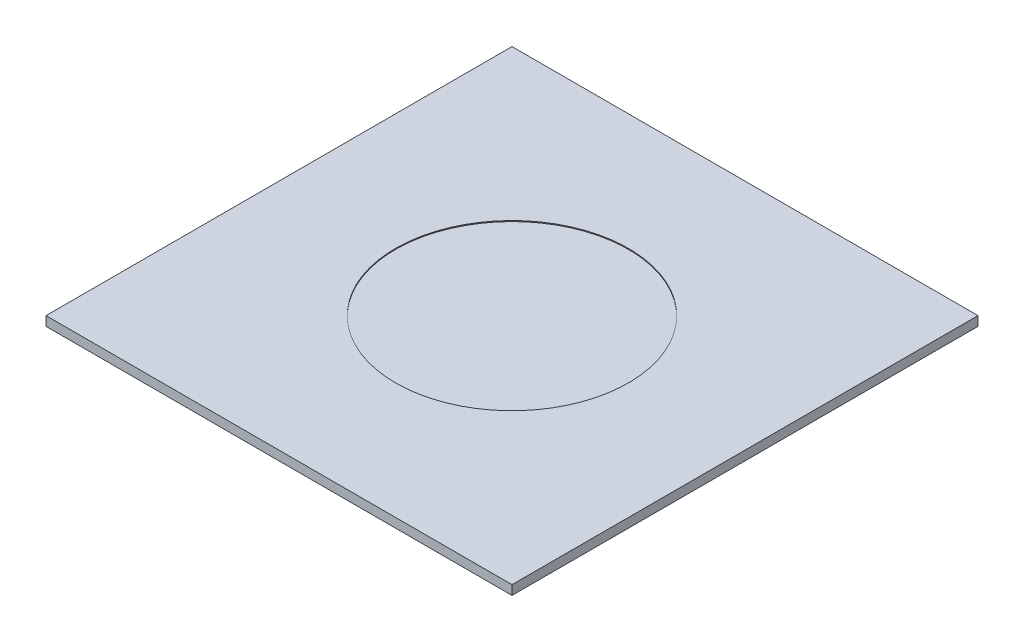
ISO-10303-21;
HEADER;
FILE_DESCRIPTION(('STEP AP214'),'2;1');
FILE_NAME('part.step','',(''),(''),'','','');
FILE_SCHEMA(('AUTOMOTIVE_DESIGN { 1 0 10303 214 1 1 1 1 }'));
ENDSEC;
DATA;
#1=APPLICATION_CONTEXT('core data for automotive mechanical design processes');
#2=APPLICATION_PROTOCOL_DEFINITION('international standard','automotive_design',2000,#1);
#3=PRODUCT_CONTEXT('',#1,'mechanical');
#4=PRODUCT('Part','Part','',(#3));
#5=PRODUCT_RELATED_PRODUCT_CATEGORY('part','',(#4));
#6=PRODUCT_DEFINITION_FORMATION('','',#4);
#7=PRODUCT_DEFINITION_CONTEXT('part definition',#1,'design');
#8=PRODUCT_DEFINITION('design','',#6,#7);
#9=PRODUCT_DEFINITION_SHAPE('','',#8);
#10=(LENGTH_UNIT() NAMED_UNIT(*) SI_UNIT(.MILLI.,.METRE.));
#11=(NAMED_UNIT(*) PLANE_ANGLE_UNIT() SI_UNIT($,.RADIAN.));
#12=(NAMED_UNIT(*) SI_UNIT($,.STERADIAN.) SOLID_ANGLE_UNIT());
#13=UNCERTAINTY_MEASURE_WITH_UNIT(LENGTH_MEASURE(1.E-05),#10,'distance_accuracy_value','');
#14=(GEOMETRIC_REPRESENTATION_CONTEXT(3) GLOBAL_UNCERTAINTY_ASSIGNED_CONTEXT((#13)) GLOBAL_UNIT_ASSIGNED_CONTEXT((#10,
#11,#12)) REPRESENTATION_CONTEXT('',''));
#15=CARTESIAN_POINT('',(0.,0.,0.));
#16=DIRECTION('',(0.,0.,1.));
#17=DIRECTION('',(1.,0.,0.));
#18=AXIS2_PLACEMENT_3D('',#15,#16,#17);
#19=CARTESIAN_POINT('',(250.,5.,-250.));
#20=DIRECTION('',(-1.,0.,0.));
#21=DIRECTION('',(0.,0.,1.));
#22=AXIS2_PLACEMENT_3D('',#19,#20,#21);
#23=PLANE('',#22);
#24=DIRECTION('',(0.,0.,-1.));
#25=VECTOR('',#24,1.);
#26=CARTESIAN_POINT('',(250.,-5.,-250.));
#27=LINE('',#26,#25);
#28=CARTESIAN_POINT('',(250.,-5.,250.));
#29=VERTEX_POINT('',#28);
#30=CARTESIAN_POINT('',(250.,-5.,-250.));
#31=VERTEX_POINT('',#30);
#32=EDGE_CURVE('E96',#29,#31,#27,.T.);
#33=ORIENTED_EDGE('',*,*,#32,.T.);
#34=DIRECTION('',(0.,-1.,0.));
#35=VECTOR('',#34,1.);
#36=CARTESIAN_POINT('',(250.,5.,-250.));
#37=LINE('',#36,#35);
#38=CARTESIAN_POINT('',(250.,5.,-250.));
#39=VERTEX_POINT('',#38);
#40=EDGE_CURVE('E11',#39,#31,#37,.T.);
#41=ORIENTED_EDGE('',*,*,#40,.F.);
#42=DIRECTION('',(0.,0.,-1.));
#43=VECTOR('',#42,1.);
#44=CARTESIAN_POINT('',(250.,5.,-250.));
#45=LINE('',#44,#43);
#46=CARTESIAN_POINT('',(250.,5.,250.));
#47=VERTEX_POINT('',#46);
#48=EDGE_CURVE('E84',#47,#39,#45,.T.);
#49=ORIENTED_EDGE('',*,*,#48,.F.);
#50=DIRECTION('',(0.,-1.,0.));
#51=VECTOR('',#50,1.);
#52=CARTESIAN_POINT('',(250.,5.,250.));
#53=LINE('',#52,#51);
#54=EDGE_CURVE('E92',#47,#29,#53,.T.);
#55=ORIENTED_EDGE('',*,*,#54,.T.);
#56=EDGE_LOOP('',(#33,#41,#49,#55));
#57=FACE_BOUND('',#56,.T.);
#58=ADVANCED_FACE('F33',(#57),#23,.F.);
#59=CARTESIAN_POINT('',(-250.,5.,-250.));
#60=DIRECTION('',(0.,0.,1.));
#61=DIRECTION('',(1.,0.,0.));
#62=AXIS2_PLACEMENT_3D('',#59,#60,#61);
#63=PLANE('',#62);
#64=DIRECTION('',(-1.,0.,0.));
#65=VECTOR('',#64,1.);
#66=CARTESIAN_POINT('',(-250.,-5.,-250.));
#67=LINE('',#66,#65);
#68=CARTESIAN_POINT('',(-250.,-5.,-250.));
#69=VERTEX_POINT('',#68);
#70=EDGE_CURVE('E88',#31,#69,#67,.T.);
#71=ORIENTED_EDGE('',*,*,#70,.T.);
#72=DIRECTION('',(0.,-1.,0.));
#73=VECTOR('',#72,1.);
#74=CARTESIAN_POINT('',(-250.,5.,-250.));
#75=LINE('',#74,#73);
#76=CARTESIAN_POINT('',(-250.,5.,-250.));
#77=VERTEX_POINT('',#76);
#78=EDGE_CURVE('E41',#77,#69,#75,.T.);
#79=ORIENTED_EDGE('',*,*,#78,.F.);
#80=DIRECTION('',(-1.,0.,0.));
#81=VECTOR('',#80,1.);
#82=CARTESIAN_POINT('',(-250.,5.,-250.));
#83=LINE('',#82,#81);
#84=EDGE_CURVE('E79',#39,#77,#83,.T.);
#85=ORIENTED_EDGE('',*,*,#84,.F.);
#86=ORIENTED_EDGE('',*,*,#40,.T.);
#87=EDGE_LOOP('',(#71,#79,#85,#86));
#88=FACE_BOUND('',#87,.T.);
#89=ADVANCED_FACE('F87',(#88),#63,.F.);
#90=CARTESIAN_POINT('',(-250.,5.,-250.));
#91=DIRECTION('',(1.,0.,0.));
#92=DIRECTION('',(0.,0.,-1.));
#93=AXIS2_PLACEMENT_3D('',#90,#91,#92);
#94=PLANE('',#93);
#95=DIRECTION('',(0.,0.,1.));
#96=VECTOR('',#95,1.);
#97=CARTESIAN_POINT('',(-250.,-5.,-250.));
#98=LINE('',#97,#96);
#99=CARTESIAN_POINT('',(-250.,-5.,250.));
#100=VERTEX_POINT('',#99);
#101=EDGE_CURVE('E66',#69,#100,#98,.T.);
#102=ORIENTED_EDGE('',*,*,#101,.T.);
#103=DIRECTION('',(0.,-1.,0.));
#104=VECTOR('',#103,1.);
#105=CARTESIAN_POINT('',(-250.,5.,250.));
#106=LINE('',#105,#104);
#107=CARTESIAN_POINT('',(-250.,5.,250.));
#108=VERTEX_POINT('',#107);
#109=EDGE_CURVE('E89',#108,#100,#106,.T.);
#110=ORIENTED_EDGE('',*,*,#109,.F.);
#111=DIRECTION('',(0.,0.,1.));
#112=VECTOR('',#111,1.);
#113=CARTESIAN_POINT('',(-250.,5.,-250.));
#114=LINE('',#113,#112);
#115=EDGE_CURVE('E82',#77,#108,#114,.T.);
#116=ORIENTED_EDGE('',*,*,#115,.F.);
#117=ORIENTED_EDGE('',*,*,#78,.T.);
#118=EDGE_LOOP('',(#102,#110,#116,#117));
#119=FACE_BOUND('',#118,.T.);
#120=ADVANCED_FACE('F90',(#119),#94,.F.);
#121=CARTESIAN_POINT('',(-250.,5.,250.));
#122=DIRECTION('',(0.,0.,-1.));
#123=DIRECTION('',(-1.,0.,0.));
#124=AXIS2_PLACEMENT_3D('',#121,#122,#123);
#125=PLANE('',#124);
#126=DIRECTION('',(1.,0.,0.));
#127=VECTOR('',#126,1.);
#128=CARTESIAN_POINT('',(-250.,-5.,250.));
#129=LINE('',#128,#127);
#130=EDGE_CURVE('E72',#100,#29,#129,.T.);
#131=ORIENTED_EDGE('',*,*,#130,.T.);
#132=ORIENTED_EDGE('',*,*,#54,.F.);
#133=DIRECTION('',(1.,0.,0.));
#134=VECTOR('',#133,1.);
#135=CARTESIAN_POINT('',(-250.,5.,250.));
#136=LINE('',#135,#134);
#137=EDGE_CURVE('E49',#108,#47,#136,.T.);
#138=ORIENTED_EDGE('',*,*,#137,.F.);
#139=ORIENTED_EDGE('',*,*,#109,.T.);
#140=EDGE_LOOP('',(#131,#132,#138,#139));
#141=FACE_BOUND('',#140,.T.);
#142=ADVANCED_FACE('F104',(#141),#125,.F.);
#143=CARTESIAN_POINT('',(0.,5.,0.));
#144=DIRECTION('',(0.,1.,0.));
#145=DIRECTION('',(0.,0.,1.));
#146=AXIS2_PLACEMENT_3D('',#143,#144,#145);
#147=PLANE('',#146);
#148=CARTESIAN_POINT('',(0.,5.,0.));
#149=DIRECTION('',(0.,1.,0.));
#150=DIRECTION('',(0.,0.,1.));
#151=AXIS2_PLACEMENT_3D('',#148,#149,#150);
#152=CIRCLE('',#151,125.);
#153=CARTESIAN_POINT('',(0.,5.,125.));
#154=VERTEX_POINT('',#153);
#155=EDGE_CURVE('E110',#154,#154,#152,.T.);
#156=ORIENTED_EDGE('',*,*,#155,.F.);
#157=EDGE_LOOP('',(#156));
#158=FACE_BOUND('',#157,.T.);
#159=ORIENTED_EDGE('',*,*,#48,.T.);
#160=ORIENTED_EDGE('',*,*,#84,.T.);
#161=ORIENTED_EDGE('',*,*,#115,.T.);
#162=ORIENTED_EDGE('',*,*,#137,.T.);
#163=EDGE_LOOP('',(#159,#160,#161,#162));
#164=FACE_BOUND('',#163,.T.);
#165=ADVANCED_FACE('F80',(#158,#164),#147,.T.);
#166=CARTESIAN_POINT('',(0.,-5.,0.));
#167=DIRECTION('',(0.,1.,0.));
#168=DIRECTION('',(0.,0.,1.));
#169=AXIS2_PLACEMENT_3D('',#166,#167,#168);
#170=PLANE('',#169);
#171=ORIENTED_EDGE('',*,*,#32,.F.);
#172=ORIENTED_EDGE('',*,*,#130,.F.);
#173=ORIENTED_EDGE('',*,*,#101,.F.);
#174=ORIENTED_EDGE('',*,*,#70,.F.);
#175=EDGE_LOOP('',(#171,#172,#173,#174));
#176=FACE_BOUND('',#175,.T.);
#177=ADVANCED_FACE('F107',(#176),#170,.F.);
#178=CARTESIAN_POINT('',(0.,4.,0.));
#179=DIRECTION('',(0.,1.,0.));
#180=DIRECTION('',(0.,0.,1.));
#181=AXIS2_PLACEMENT_3D('',#178,#179,#180);
#182=CYLINDRICAL_SURFACE('',#181,125.);
#183=CARTESIAN_POINT('',(0.,4.,0.));
#184=DIRECTION('',(0.,1.,0.));
#185=DIRECTION('',(0.,0.,1.));
#186=AXIS2_PLACEMENT_3D('',#183,#184,#185);
#187=CIRCLE('',#186,125.);
#188=CARTESIAN_POINT('',(0.,4.,125.));
#189=VERTEX_POINT('',#188);
#190=EDGE_CURVE('E99',#189,#189,#187,.T.);
#191=ORIENTED_EDGE('',*,*,#190,.F.);
#192=EDGE_LOOP('',(#191));
#193=FACE_BOUND('',#192,.T.);
#194=ORIENTED_EDGE('',*,*,#155,.T.);
#195=EDGE_LOOP('',(#194));
#196=FACE_BOUND('',#195,.T.);
#197=ADVANCED_FACE('F118',(#193,#196),#182,.F.);
#198=CARTESIAN_POINT('',(0.,4.,0.));
#199=DIRECTION('',(0.,1.,0.));
#200=DIRECTION('',(0.,0.,1.));
#201=AXIS2_PLACEMENT_3D('',#198,#199,#200);
#202=PLANE('',#201);
#203=ORIENTED_EDGE('',*,*,#190,.T.);
#204=EDGE_LOOP('',(#203));
#205=FACE_BOUND('',#204,.T.);
#206=ADVANCED_FACE('F116',(#205),#202,.T.);
#207=CLOSED_SHELL('',(#58,#89,#120,#142,#165,#177,#197,#206));
#208=MANIFOLD_SOLID_BREP('B2',#207);
#209=ADVANCED_BREP_SHAPE_REPRESENTATION('',(#18,#208),#14);
#210=SHAPE_DEFINITION_REPRESENTATION(#9,#209);
ENDSEC;
END-ISO-10303-21;
